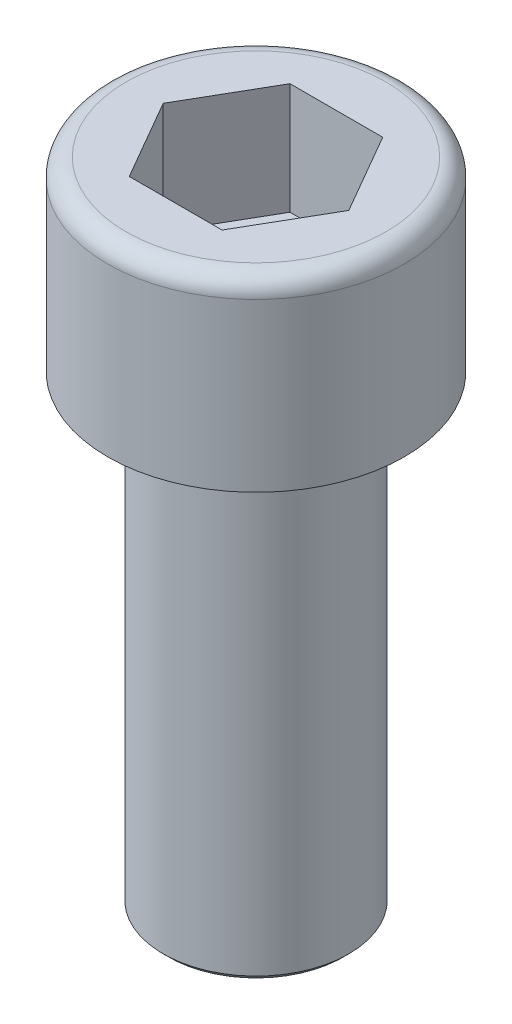
ISO-10303-21;
HEADER;
FILE_DESCRIPTION(('STEP AP214'),'2;1');
FILE_NAME('part.step','',(''),(''),'','','');
FILE_SCHEMA(('AUTOMOTIVE_DESIGN { 1 0 10303 214 1 1 1 1 }'));
ENDSEC;
DATA;
#1=APPLICATION_CONTEXT('core data for automotive mechanical design processes');
#2=APPLICATION_PROTOCOL_DEFINITION('international standard','automotive_design',2000,#1);
#3=PRODUCT_CONTEXT('',#1,'mechanical');
#4=PRODUCT('Part','Part','',(#3));
#5=PRODUCT_RELATED_PRODUCT_CATEGORY('part','',(#4));
#6=PRODUCT_DEFINITION_FORMATION('','',#4);
#7=PRODUCT_DEFINITION_CONTEXT('part definition',#1,'design');
#8=PRODUCT_DEFINITION('design','',#6,#7);
#9=PRODUCT_DEFINITION_SHAPE('','',#8);
#10=(LENGTH_UNIT() NAMED_UNIT(*) SI_UNIT(.MILLI.,.METRE.));
#11=(NAMED_UNIT(*) PLANE_ANGLE_UNIT() SI_UNIT($,.RADIAN.));
#12=(NAMED_UNIT(*) SI_UNIT($,.STERADIAN.) SOLID_ANGLE_UNIT());
#13=UNCERTAINTY_MEASURE_WITH_UNIT(LENGTH_MEASURE(1.E-05),#10,'distance_accuracy_value','');
#14=(GEOMETRIC_REPRESENTATION_CONTEXT(3) GLOBAL_UNCERTAINTY_ASSIGNED_CONTEXT((#13)) GLOBAL_UNIT_ASSIGNED_CONTEXT((#10,
#11,#12)) REPRESENTATION_CONTEXT('',''));
#15=CARTESIAN_POINT('',(0.,0.,0.));
#16=DIRECTION('',(0.,0.,1.));
#17=DIRECTION('',(1.,0.,0.));
#18=AXIS2_PLACEMENT_3D('',#15,#16,#17);
#19=CARTESIAN_POINT('',(0.,10.,0.));
#20=DIRECTION('',(0.,-1.,0.));
#21=DIRECTION('',(1.,0.,0.));
#22=AXIS2_PLACEMENT_3D('',#19,#20,#21);
#23=PLANE('',#22);
#24=DIRECTION('',(-0.5,0.,-0.866025403784439));
#25=VECTOR('',#24,1.);
#26=CARTESIAN_POINT('',(5.,10.,0.));
#27=LINE('',#26,#25);
#28=CARTESIAN_POINT('',(5.,10.,0.));
#29=VERTEX_POINT('',#28);
#30=CARTESIAN_POINT('',(2.5,10.,-4.33012701892219));
#31=VERTEX_POINT('',#30);
#32=EDGE_CURVE('E119',#29,#31,#27,.T.);
#33=ORIENTED_EDGE('',*,*,#32,.F.);
#34=DIRECTION('',(0.5,0.,-0.866025403784439));
#35=VECTOR('',#34,1.);
#36=CARTESIAN_POINT('',(2.5,10.,4.3301270189222));
#37=LINE('',#36,#35);
#38=CARTESIAN_POINT('',(2.5,10.,4.3301270189222));
#39=VERTEX_POINT('',#38);
#40=EDGE_CURVE('E45',#39,#29,#37,.T.);
#41=ORIENTED_EDGE('',*,*,#40,.F.);
#42=DIRECTION('',(1.,0.,0.));
#43=VECTOR('',#42,1.);
#44=CARTESIAN_POINT('',(-2.5,10.,4.33012701892219));
#45=LINE('',#44,#43);
#46=CARTESIAN_POINT('',(-2.5,10.,4.33012701892219));
#47=VERTEX_POINT('',#46);
#48=EDGE_CURVE('E128',#47,#39,#45,.T.);
#49=ORIENTED_EDGE('',*,*,#48,.F.);
#50=DIRECTION('',(0.5,0.,0.866025403784439));
#51=VECTOR('',#50,1.);
#52=CARTESIAN_POINT('',(-5.,10.,0.));
#53=LINE('',#52,#51);
#54=CARTESIAN_POINT('',(-5.,10.,0.));
#55=VERTEX_POINT('',#54);
#56=EDGE_CURVE('E126',#55,#47,#53,.T.);
#57=ORIENTED_EDGE('',*,*,#56,.F.);
#58=DIRECTION('',(-0.5,0.,0.866025403784439));
#59=VECTOR('',#58,1.);
#60=CARTESIAN_POINT('',(-2.5,10.,-4.3301270189222));
#61=LINE('',#60,#59);
#62=CARTESIAN_POINT('',(-2.5,10.,-4.3301270189222));
#63=VERTEX_POINT('',#62);
#64=EDGE_CURVE('E93',#63,#55,#61,.T.);
#65=ORIENTED_EDGE('',*,*,#64,.F.);
#66=DIRECTION('',(-1.,0.,0.));
#67=VECTOR('',#66,1.);
#68=CARTESIAN_POINT('',(2.5,10.,-4.33012701892219));
#69=LINE('',#68,#67);
#70=EDGE_CURVE('E122',#31,#63,#69,.T.);
#71=ORIENTED_EDGE('',*,*,#70,.F.);
#72=EDGE_LOOP('',(#33,#41,#49,#57,#65,#71));
#73=FACE_BOUND('',#72,.T.);
#74=CARTESIAN_POINT('',(0.,10.,0.));
#75=DIRECTION('',(0.,-1.,0.));
#76=DIRECTION('',(1.,0.,0.));
#77=AXIS2_PLACEMENT_3D('',#74,#75,#76);
#78=CIRCLE('',#77,7.);
#79=CARTESIAN_POINT('',(7.,10.,0.));
#80=VERTEX_POINT('',#79);
#81=EDGE_CURVE('E143',#80,#80,#78,.F.);
#82=ORIENTED_EDGE('',*,*,#81,.T.);
#83=EDGE_LOOP('',(#82));
#84=FACE_BOUND('',#83,.T.);
#85=ADVANCED_FACE('F30',(#73,#84),#23,.F.);
#86=CARTESIAN_POINT('',(0.,10.,0.));
#87=DIRECTION('',(0.,1.,0.));
#88=DIRECTION('',(-1.,0.,0.));
#89=AXIS2_PLACEMENT_3D('',#86,#87,#88);
#90=CYLINDRICAL_SURFACE('',#89,8.);
#91=CARTESIAN_POINT('',(0.,9.,0.));
#92=DIRECTION('',(0.,-1.,0.));
#93=DIRECTION('',(1.,0.,0.));
#94=AXIS2_PLACEMENT_3D('',#91,#92,#93);
#95=CIRCLE('',#94,8.);
#96=CARTESIAN_POINT('',(8.,9.,0.));
#97=VERTEX_POINT('',#96);
#98=EDGE_CURVE('E146',#97,#97,#95,.T.);
#99=ORIENTED_EDGE('',*,*,#98,.T.);
#100=EDGE_LOOP('',(#99));
#101=FACE_BOUND('',#100,.T.);
#102=CARTESIAN_POINT('',(0.,0.,0.));
#103=DIRECTION('',(0.,1.,0.));
#104=DIRECTION('',(-1.,0.,0.));
#105=AXIS2_PLACEMENT_3D('',#102,#103,#104);
#106=CIRCLE('',#105,8.);
#107=CARTESIAN_POINT('',(-8.,0.,0.));
#108=VERTEX_POINT('',#107);
#109=EDGE_CURVE('E140',#108,#108,#106,.T.);
#110=ORIENTED_EDGE('',*,*,#109,.T.);
#111=EDGE_LOOP('',(#110));
#112=FACE_BOUND('',#111,.T.);
#113=ADVANCED_FACE('F163',(#101,#112),#90,.T.);
#114=CARTESIAN_POINT('',(8.,0.,0.));
#115=DIRECTION('',(0.,1.,0.));
#116=DIRECTION('',(-1.,0.,0.));
#117=AXIS2_PLACEMENT_3D('',#114,#115,#116);
#118=PLANE('',#117);
#119=ORIENTED_EDGE('',*,*,#109,.F.);
#120=EDGE_LOOP('',(#119));
#121=FACE_BOUND('',#120,.T.);
#122=CARTESIAN_POINT('',(0.,0.,0.));
#123=DIRECTION('',(0.,1.,0.));
#124=DIRECTION('',(-1.,0.,0.));
#125=AXIS2_PLACEMENT_3D('',#122,#123,#124);
#126=CIRCLE('',#125,5.);
#127=CARTESIAN_POINT('',(-5.,0.,0.));
#128=VERTEX_POINT('',#127);
#129=EDGE_CURVE('E132',#128,#128,#126,.T.);
#130=ORIENTED_EDGE('',*,*,#129,.T.);
#131=EDGE_LOOP('',(#130));
#132=FACE_BOUND('',#131,.T.);
#133=ADVANCED_FACE('F169',(#121,#132),#118,.F.);
#134=CARTESIAN_POINT('',(0.,10.,0.));
#135=DIRECTION('',(0.,1.,0.));
#136=DIRECTION('',(-1.,0.,0.));
#137=AXIS2_PLACEMENT_3D('',#134,#135,#136);
#138=CYLINDRICAL_SURFACE('',#137,5.);
#139=CARTESIAN_POINT('',(0.,-24.7,0.));
#140=DIRECTION('',(0.,1.,0.));
#141=DIRECTION('',(-1.,0.,0.));
#142=AXIS2_PLACEMENT_3D('',#139,#140,#141);
#143=CIRCLE('',#142,5.);
#144=CARTESIAN_POINT('',(-5.,-24.7,0.));
#145=VERTEX_POINT('',#144);
#146=EDGE_CURVE('E38',#145,#145,#143,.T.);
#147=ORIENTED_EDGE('',*,*,#146,.T.);
#148=EDGE_LOOP('',(#147));
#149=FACE_BOUND('',#148,.T.);
#150=ORIENTED_EDGE('',*,*,#129,.F.);
#151=EDGE_LOOP('',(#150));
#152=FACE_BOUND('',#151,.T.);
#153=ADVANCED_FACE('F151',(#149,#152),#138,.T.);
#154=CARTESIAN_POINT('',(5.,-25.,0.));
#155=DIRECTION('',(0.,1.,0.));
#156=DIRECTION('',(-1.,0.,0.));
#157=AXIS2_PLACEMENT_3D('',#154,#155,#156);
#158=PLANE('',#157);
#159=CARTESIAN_POINT('',(0.,-25.,0.));
#160=DIRECTION('',(0.,1.,0.));
#161=DIRECTION('',(-1.,0.,0.));
#162=AXIS2_PLACEMENT_3D('',#159,#160,#161);
#163=CIRCLE('',#162,4.70000000000001);
#164=CARTESIAN_POINT('',(-4.70000000000001,-25.,0.));
#165=VERTEX_POINT('',#164);
#166=EDGE_CURVE('E11',#165,#165,#163,.F.);
#167=ORIENTED_EDGE('',*,*,#166,.T.);
#168=EDGE_LOOP('',(#167));
#169=FACE_BOUND('',#168,.T.);
#170=ADVANCED_FACE('F178',(#169),#158,.F.);
#171=CARTESIAN_POINT('',(0.,9.,0.));
#172=DIRECTION('',(0.,-1.,0.));
#173=DIRECTION('',(1.,0.,0.));
#174=AXIS2_PLACEMENT_3D('',#171,#172,#173);
#175=TOROIDAL_SURFACE('',#174,7.,1.);
#176=ORIENTED_EDGE('',*,*,#98,.F.);
#177=EDGE_LOOP('',(#176));
#178=FACE_BOUND('',#177,.T.);
#179=ORIENTED_EDGE('',*,*,#81,.F.);
#180=EDGE_LOOP('',(#179));
#181=FACE_BOUND('',#180,.T.);
#182=ADVANCED_FACE('F175',(#178,#181),#175,.T.);
#183=CARTESIAN_POINT('',(2.5,4.,4.3301270189222));
#184=DIRECTION('',(0.866025403784438,0.,0.5));
#185=DIRECTION('',(0.5,0.,-0.866025403784439));
#186=AXIS2_PLACEMENT_3D('',#183,#184,#185);
#187=PLANE('',#186);
#188=ORIENTED_EDGE('',*,*,#40,.T.);
#189=DIRECTION('',(0.,1.,0.));
#190=VECTOR('',#189,1.);
#191=CARTESIAN_POINT('',(5.,4.,0.));
#192=LINE('',#191,#190);
#193=CARTESIAN_POINT('',(5.,4.,0.));
#194=VERTEX_POINT('',#193);
#195=EDGE_CURVE('E75',#194,#29,#192,.T.);
#196=ORIENTED_EDGE('',*,*,#195,.F.);
#197=DIRECTION('',(0.5,0.,-0.866025403784439));
#198=VECTOR('',#197,1.);
#199=CARTESIAN_POINT('',(2.5,4.,4.3301270189222));
#200=LINE('',#199,#198);
#201=CARTESIAN_POINT('',(2.5,4.,4.3301270189222));
#202=VERTEX_POINT('',#201);
#203=EDGE_CURVE('E130',#202,#194,#200,.T.);
#204=ORIENTED_EDGE('',*,*,#203,.F.);
#205=DIRECTION('',(0.,1.,0.));
#206=VECTOR('',#205,1.);
#207=CARTESIAN_POINT('',(2.5,4.,4.3301270189222));
#208=LINE('',#207,#206);
#209=EDGE_CURVE('E53',#202,#39,#208,.T.);
#210=ORIENTED_EDGE('',*,*,#209,.T.);
#211=EDGE_LOOP('',(#188,#196,#204,#210));
#212=FACE_BOUND('',#211,.T.);
#213=ADVANCED_FACE('F177',(#212),#187,.F.);
#214=CARTESIAN_POINT('',(-2.5,4.,4.33012701892219));
#215=DIRECTION('',(0.,0.,1.));
#216=DIRECTION('',(1.,0.,0.));
#217=AXIS2_PLACEMENT_3D('',#214,#215,#216);
#218=PLANE('',#217);
#219=ORIENTED_EDGE('',*,*,#48,.T.);
#220=ORIENTED_EDGE('',*,*,#209,.F.);
#221=DIRECTION('',(1.,0.,0.));
#222=VECTOR('',#221,1.);
#223=CARTESIAN_POINT('',(-2.5,4.,4.33012701892219));
#224=LINE('',#223,#222);
#225=CARTESIAN_POINT('',(-2.5,4.,4.33012701892219));
#226=VERTEX_POINT('',#225);
#227=EDGE_CURVE('E105',#226,#202,#224,.T.);
#228=ORIENTED_EDGE('',*,*,#227,.F.);
#229=DIRECTION('',(0.,1.,0.));
#230=VECTOR('',#229,1.);
#231=CARTESIAN_POINT('',(-2.5,4.,4.33012701892219));
#232=LINE('',#231,#230);
#233=EDGE_CURVE('E97',#226,#47,#232,.T.);
#234=ORIENTED_EDGE('',*,*,#233,.T.);
#235=EDGE_LOOP('',(#219,#220,#228,#234));
#236=FACE_BOUND('',#235,.T.);
#237=ADVANCED_FACE('F184',(#236),#218,.F.);
#238=CARTESIAN_POINT('',(-5.,4.,0.));
#239=DIRECTION('',(-0.866025403784439,0.,0.5));
#240=DIRECTION('',(0.5,0.,0.866025403784439));
#241=AXIS2_PLACEMENT_3D('',#238,#239,#240);
#242=PLANE('',#241);
#243=ORIENTED_EDGE('',*,*,#56,.T.);
#244=ORIENTED_EDGE('',*,*,#233,.F.);
#245=DIRECTION('',(0.5,0.,0.866025403784439));
#246=VECTOR('',#245,1.);
#247=CARTESIAN_POINT('',(-5.,4.,0.));
#248=LINE('',#247,#246);
#249=CARTESIAN_POINT('',(-5.,4.,0.));
#250=VERTEX_POINT('',#249);
#251=EDGE_CURVE('E101',#250,#226,#248,.T.);
#252=ORIENTED_EDGE('',*,*,#251,.F.);
#253=DIRECTION('',(0.,1.,0.));
#254=VECTOR('',#253,1.);
#255=CARTESIAN_POINT('',(-5.,4.,0.));
#256=LINE('',#255,#254);
#257=EDGE_CURVE('E86',#250,#55,#256,.T.);
#258=ORIENTED_EDGE('',*,*,#257,.T.);
#259=EDGE_LOOP('',(#243,#244,#252,#258));
#260=FACE_BOUND('',#259,.T.);
#261=ADVANCED_FACE('F102',(#260),#242,.F.);
#262=CARTESIAN_POINT('',(-2.5,4.,-4.3301270189222));
#263=DIRECTION('',(-0.866025403784438,0.,-0.5));
#264=DIRECTION('',(-0.5,0.,0.866025403784439));
#265=AXIS2_PLACEMENT_3D('',#262,#263,#264);
#266=PLANE('',#265);
#267=ORIENTED_EDGE('',*,*,#64,.T.);
#268=ORIENTED_EDGE('',*,*,#257,.F.);
#269=DIRECTION('',(-0.5,0.,0.866025403784439));
#270=VECTOR('',#269,1.);
#271=CARTESIAN_POINT('',(-2.5,4.,-4.3301270189222));
#272=LINE('',#271,#270);
#273=CARTESIAN_POINT('',(-2.5,4.,-4.3301270189222));
#274=VERTEX_POINT('',#273);
#275=EDGE_CURVE('E90',#274,#250,#272,.T.);
#276=ORIENTED_EDGE('',*,*,#275,.F.);
#277=DIRECTION('',(0.,1.,0.));
#278=VECTOR('',#277,1.);
#279=CARTESIAN_POINT('',(-2.5,4.,-4.3301270189222));
#280=LINE('',#279,#278);
#281=EDGE_CURVE('E98',#274,#63,#280,.T.);
#282=ORIENTED_EDGE('',*,*,#281,.T.);
#283=EDGE_LOOP('',(#267,#268,#276,#282));
#284=FACE_BOUND('',#283,.T.);
#285=ADVANCED_FACE('F88',(#284),#266,.F.);
#286=CARTESIAN_POINT('',(2.5,4.,-4.33012701892219));
#287=DIRECTION('',(0.,0.,-1.));
#288=DIRECTION('',(-1.,0.,0.));
#289=AXIS2_PLACEMENT_3D('',#286,#287,#288);
#290=PLANE('',#289);
#291=ORIENTED_EDGE('',*,*,#70,.T.);
#292=ORIENTED_EDGE('',*,*,#281,.F.);
#293=DIRECTION('',(-1.,0.,0.));
#294=VECTOR('',#293,1.);
#295=CARTESIAN_POINT('',(2.5,4.,-4.33012701892219));
#296=LINE('',#295,#294);
#297=CARTESIAN_POINT('',(2.5,4.,-4.33012701892219));
#298=VERTEX_POINT('',#297);
#299=EDGE_CURVE('E111',#298,#274,#296,.T.);
#300=ORIENTED_EDGE('',*,*,#299,.F.);
#301=DIRECTION('',(0.,1.,0.));
#302=VECTOR('',#301,1.);
#303=CARTESIAN_POINT('',(2.5,4.,-4.33012701892219));
#304=LINE('',#303,#302);
#305=EDGE_CURVE('E135',#298,#31,#304,.T.);
#306=ORIENTED_EDGE('',*,*,#305,.T.);
#307=EDGE_LOOP('',(#291,#292,#300,#306));
#308=FACE_BOUND('',#307,.T.);
#309=ADVANCED_FACE('F204',(#308),#290,.F.);
#310=CARTESIAN_POINT('',(5.,4.,0.));
#311=DIRECTION('',(0.866025403784439,0.,-0.5));
#312=DIRECTION('',(-0.5,0.,-0.866025403784439));
#313=AXIS2_PLACEMENT_3D('',#310,#311,#312);
#314=PLANE('',#313);
#315=ORIENTED_EDGE('',*,*,#32,.T.);
#316=ORIENTED_EDGE('',*,*,#305,.F.);
#317=DIRECTION('',(-0.5,0.,-0.866025403784439));
#318=VECTOR('',#317,1.);
#319=CARTESIAN_POINT('',(5.,4.,0.));
#320=LINE('',#319,#318);
#321=EDGE_CURVE('E113',#194,#298,#320,.T.);
#322=ORIENTED_EDGE('',*,*,#321,.F.);
#323=ORIENTED_EDGE('',*,*,#195,.T.);
#324=EDGE_LOOP('',(#315,#316,#322,#323));
#325=FACE_BOUND('',#324,.T.);
#326=ADVANCED_FACE('F159',(#325),#314,.F.);
#327=CARTESIAN_POINT('',(5.,4.,0.));
#328=DIRECTION('',(0.,1.,0.));
#329=DIRECTION('',(0.,0.,1.));
#330=AXIS2_PLACEMENT_3D('',#327,#328,#329);
#331=PLANE('',#330);
#332=ORIENTED_EDGE('',*,*,#203,.T.);
#333=ORIENTED_EDGE('',*,*,#321,.T.);
#334=ORIENTED_EDGE('',*,*,#299,.T.);
#335=ORIENTED_EDGE('',*,*,#275,.T.);
#336=ORIENTED_EDGE('',*,*,#251,.T.);
#337=ORIENTED_EDGE('',*,*,#227,.T.);
#338=EDGE_LOOP('',(#332,#333,#334,#335,#336,#337));
#339=FACE_BOUND('',#338,.T.);
#340=ADVANCED_FACE('F108',(#339),#331,.T.);
#341=CARTESIAN_POINT('',(0.,-24.7,0.));
#342=DIRECTION('',(0.,1.,0.));
#343=DIRECTION('',(-1.,0.,0.));
#344=AXIS2_PLACEMENT_3D('',#341,#342,#343);
#345=CONICAL_SURFACE('',#344,5.,0.785398163397445);
#346=ORIENTED_EDGE('',*,*,#166,.F.);
#347=EDGE_LOOP('',(#346));
#348=FACE_BOUND('',#347,.T.);
#349=ORIENTED_EDGE('',*,*,#146,.F.);
#350=EDGE_LOOP('',(#349));
#351=FACE_BOUND('',#350,.T.);
#352=ADVANCED_FACE('F32',(#348,#351),#345,.T.);
#353=CLOSED_SHELL('',(#85,#113,#133,#153,#170,#182,#213,#237,#261,#285,#309,#326,#340,#352));
#354=MANIFOLD_SOLID_BREP('B2',#353);
#355=ADVANCED_BREP_SHAPE_REPRESENTATION('',(#18,#354),#14);
#356=SHAPE_DEFINITION_REPRESENTATION(#9,#355);
ENDSEC;
END-ISO-10303-21;
